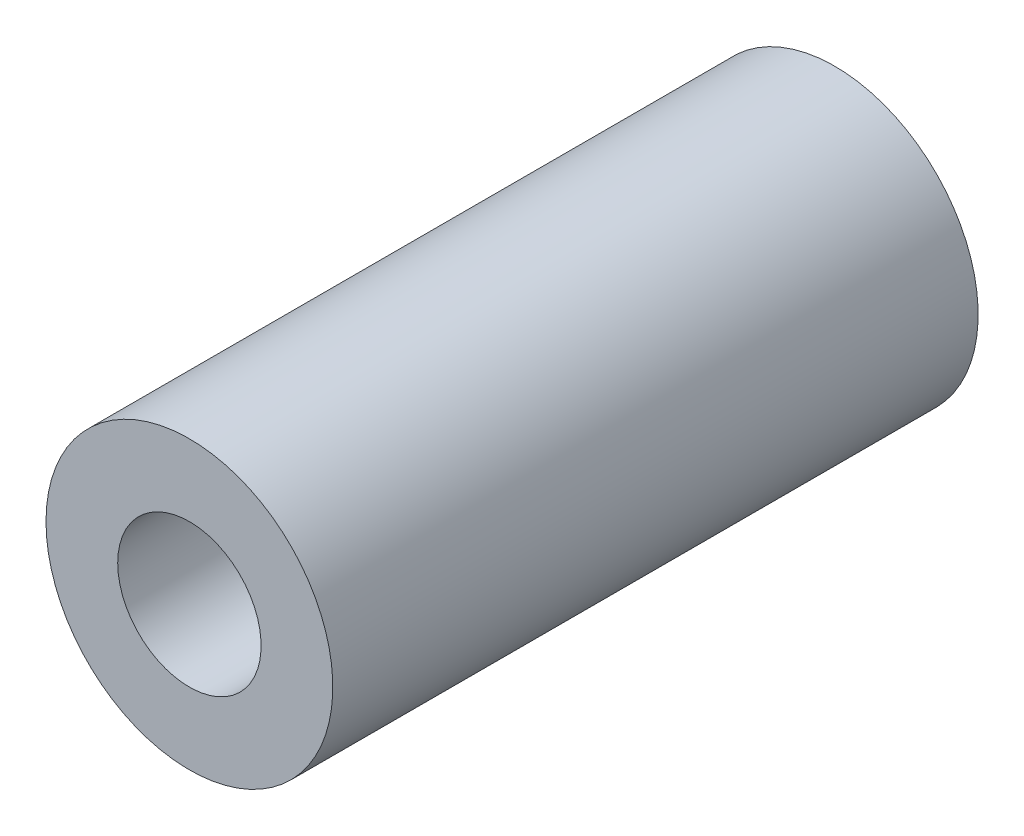
ISO-10303-21;
HEADER;
FILE_DESCRIPTION(('STEP AP214'),'2;1');
FILE_NAME('part.step','',(''),(''),'','','');
FILE_SCHEMA(('AUTOMOTIVE_DESIGN { 1 0 10303 214 1 1 1 1 }'));
ENDSEC;
DATA;
#1=APPLICATION_CONTEXT('core data for automotive mechanical design processes');
#2=APPLICATION_PROTOCOL_DEFINITION('international standard','automotive_design',2000,#1);
#3=PRODUCT_CONTEXT('',#1,'mechanical');
#4=PRODUCT('Part','Part','',(#3));
#5=PRODUCT_RELATED_PRODUCT_CATEGORY('part','',(#4));
#6=PRODUCT_DEFINITION_FORMATION('','',#4);
#7=PRODUCT_DEFINITION_CONTEXT('part definition',#1,'design');
#8=PRODUCT_DEFINITION('design','',#6,#7);
#9=PRODUCT_DEFINITION_SHAPE('','',#8);
#10=(LENGTH_UNIT() NAMED_UNIT(*) SI_UNIT(.MILLI.,.METRE.));
#11=(NAMED_UNIT(*) PLANE_ANGLE_UNIT() SI_UNIT($,.RADIAN.));
#12=(NAMED_UNIT(*) SI_UNIT($,.STERADIAN.) SOLID_ANGLE_UNIT());
#13=UNCERTAINTY_MEASURE_WITH_UNIT(LENGTH_MEASURE(1.E-05),#10,'distance_accuracy_value','');
#14=(GEOMETRIC_REPRESENTATION_CONTEXT(3) GLOBAL_UNCERTAINTY_ASSIGNED_CONTEXT((#13)) GLOBAL_UNIT_ASSIGNED_CONTEXT((#10,
#11,#12)) REPRESENTATION_CONTEXT('',''));
#15=CARTESIAN_POINT('',(0.,0.,0.));
#16=DIRECTION('',(0.,0.,1.));
#17=DIRECTION('',(1.,0.,0.));
#18=AXIS2_PLACEMENT_3D('',#15,#16,#17);
#19=CARTESIAN_POINT('',(0.,0.,45.));
#20=DIRECTION('',(0.,0.,1.));
#21=DIRECTION('',(1.,0.,0.));
#22=AXIS2_PLACEMENT_3D('',#19,#20,#21);
#23=PLANE('',#22);
#24=CARTESIAN_POINT('',(0.,0.,45.));
#25=DIRECTION('',(0.,0.,1.));
#26=DIRECTION('',(1.,0.,0.));
#27=AXIS2_PLACEMENT_3D('',#24,#25,#26);
#28=CIRCLE('',#27,10.);
#29=CARTESIAN_POINT('',(-10.,0.,45.));
#30=VERTEX_POINT('',#29);
#31=EDGE_CURVE('E10',#30,#30,#28,.T.);
#32=ORIENTED_EDGE('',*,*,#31,.T.);
#33=EDGE_LOOP('',(#32));
#34=FACE_BOUND('',#33,.T.);
#35=CARTESIAN_POINT('',(0.,0.,45.));
#36=DIRECTION('',(0.,0.,1.));
#37=DIRECTION('',(1.,0.,0.));
#38=AXIS2_PLACEMENT_3D('',#35,#36,#37);
#39=CIRCLE('',#38,5.);
#40=CARTESIAN_POINT('',(-5.,0.,45.));
#41=VERTEX_POINT('',#40);
#42=EDGE_CURVE('E50',#41,#41,#39,.T.);
#43=ORIENTED_EDGE('',*,*,#42,.F.);
#44=EDGE_LOOP('',(#43));
#45=FACE_BOUND('',#44,.T.);
#46=ADVANCED_FACE('F37',(#34,#45),#23,.T.);
#47=CARTESIAN_POINT('',(0.,0.,0.));
#48=DIRECTION('',(0.,0.,1.));
#49=DIRECTION('',(1.,0.,0.));
#50=AXIS2_PLACEMENT_3D('',#47,#48,#49);
#51=PLANE('',#50);
#52=CARTESIAN_POINT('',(0.,0.,0.));
#53=DIRECTION('',(0.,0.,1.));
#54=DIRECTION('',(1.,0.,0.));
#55=AXIS2_PLACEMENT_3D('',#52,#53,#54);
#56=CIRCLE('',#55,10.);
#57=CARTESIAN_POINT('',(-10.,0.,0.));
#58=VERTEX_POINT('',#57);
#59=EDGE_CURVE('E41',#58,#58,#56,.T.);
#60=ORIENTED_EDGE('',*,*,#59,.F.);
#61=EDGE_LOOP('',(#60));
#62=FACE_BOUND('',#61,.T.);
#63=CARTESIAN_POINT('',(0.,0.,0.));
#64=DIRECTION('',(0.,0.,1.));
#65=DIRECTION('',(1.,0.,0.));
#66=AXIS2_PLACEMENT_3D('',#63,#64,#65);
#67=CIRCLE('',#66,5.);
#68=CARTESIAN_POINT('',(-5.,0.,0.));
#69=VERTEX_POINT('',#68);
#70=EDGE_CURVE('E52',#69,#69,#67,.T.);
#71=ORIENTED_EDGE('',*,*,#70,.T.);
#72=EDGE_LOOP('',(#71));
#73=FACE_BOUND('',#72,.T.);
#74=ADVANCED_FACE('F64',(#62,#73),#51,.F.);
#75=CARTESIAN_POINT('',(0.,0.,45.));
#76=DIRECTION('',(0.,0.,-1.));
#77=DIRECTION('',(-1.,0.,0.));
#78=AXIS2_PLACEMENT_3D('',#75,#76,#77);
#79=CYLINDRICAL_SURFACE('',#78,10.);
#80=CARTESIAN_POINT('',(-10.,0.,45.));
#81=CARTESIAN_POINT('',(-10.,0.,44.53125));
#82=CARTESIAN_POINT('',(-10.,0.,44.0625));
#83=CARTESIAN_POINT('',(-10.,0.,43.125));
#84=CARTESIAN_POINT('',(-10.,0.,42.65625));
#85=CARTESIAN_POINT('',(-10.,0.,41.71875));
#86=CARTESIAN_POINT('',(-10.,0.,41.25));
#87=CARTESIAN_POINT('',(-10.,0.,40.3125));
#88=CARTESIAN_POINT('',(-10.,0.,39.84375));
#89=CARTESIAN_POINT('',(-10.,0.,38.90625));
#90=CARTESIAN_POINT('',(-10.,0.,38.4375));
#91=CARTESIAN_POINT('',(-10.,0.,37.5));
#92=CARTESIAN_POINT('',(-10.,0.,37.03125));
#93=CARTESIAN_POINT('',(-10.,0.,36.09375));
#94=CARTESIAN_POINT('',(-10.,0.,35.625));
#95=CARTESIAN_POINT('',(-10.,0.,34.6875));
#96=CARTESIAN_POINT('',(-10.,0.,34.21875));
#97=CARTESIAN_POINT('',(-10.,0.,33.28125));
#98=CARTESIAN_POINT('',(-10.,0.,32.8125));
#99=CARTESIAN_POINT('',(-10.,0.,31.875));
#100=CARTESIAN_POINT('',(-10.,0.,31.40625));
#101=CARTESIAN_POINT('',(-10.,0.,30.46875));
#102=CARTESIAN_POINT('',(-10.,0.,30.));
#103=CARTESIAN_POINT('',(-10.,0.,29.0625));
#104=CARTESIAN_POINT('',(-10.,0.,28.59375));
#105=CARTESIAN_POINT('',(-10.,0.,27.65625));
#106=CARTESIAN_POINT('',(-10.,0.,27.1875));
#107=CARTESIAN_POINT('',(-10.,0.,26.25));
#108=CARTESIAN_POINT('',(-10.,0.,25.78125));
#109=CARTESIAN_POINT('',(-10.,0.,24.84375));
#110=CARTESIAN_POINT('',(-10.,0.,24.375));
#111=CARTESIAN_POINT('',(-10.,0.,23.4375));
#112=CARTESIAN_POINT('',(-10.,0.,22.96875));
#113=CARTESIAN_POINT('',(-10.,0.,22.03125));
#114=CARTESIAN_POINT('',(-10.,0.,21.5625));
#115=CARTESIAN_POINT('',(-10.,0.,20.625));
#116=CARTESIAN_POINT('',(-10.,0.,20.15625));
#117=CARTESIAN_POINT('',(-10.,0.,19.21875));
#118=CARTESIAN_POINT('',(-10.,0.,18.75));
#119=CARTESIAN_POINT('',(-10.,0.,17.8125));
#120=CARTESIAN_POINT('',(-10.,0.,17.34375));
#121=CARTESIAN_POINT('',(-10.,0.,16.40625));
#122=CARTESIAN_POINT('',(-10.,0.,15.9375));
#123=CARTESIAN_POINT('',(-10.,0.,15.));
#124=CARTESIAN_POINT('',(-10.,0.,14.53125));
#125=CARTESIAN_POINT('',(-10.,0.,13.59375));
#126=CARTESIAN_POINT('',(-10.,0.,13.125));
#127=CARTESIAN_POINT('',(-10.,0.,12.1875));
#128=CARTESIAN_POINT('',(-10.,0.,11.71875));
#129=CARTESIAN_POINT('',(-10.,0.,10.78125));
#130=CARTESIAN_POINT('',(-10.,0.,10.3125));
#131=CARTESIAN_POINT('',(-10.,0.,9.375));
#132=CARTESIAN_POINT('',(-10.,0.,8.90625));
#133=CARTESIAN_POINT('',(-10.,0.,7.96874999999999));
#134=CARTESIAN_POINT('',(-10.,0.,7.5));
#135=CARTESIAN_POINT('',(-10.,0.,6.5625));
#136=CARTESIAN_POINT('',(-10.,0.,6.09375));
#137=CARTESIAN_POINT('',(-10.,0.,5.15625));
#138=CARTESIAN_POINT('',(-10.,0.,4.68749999999999));
#139=CARTESIAN_POINT('',(-10.,0.,3.74999999999999));
#140=CARTESIAN_POINT('',(-10.,0.,3.28124999999999));
#141=CARTESIAN_POINT('',(-10.,0.,2.34374999999999));
#142=CARTESIAN_POINT('',(-10.,0.,1.87499999999999));
#143=CARTESIAN_POINT('',(-10.,0.,0.937499999999992));
#144=CARTESIAN_POINT('',(-10.,0.,0.468749999999993));
#145=CARTESIAN_POINT('',(-10.,0.,0.));
#146=B_SPLINE_CURVE_WITH_KNOTS('',3,(#80,#81,#82,#83,#84,#85,#86,#87,#88,#89,#90,#91,#92,#93,
#94,#95,#96,#97,#98,#99,#100,#101,#102,#103,#104,#105,#106,#107,#108,#109,#110,#111,#112,#113,
#114,#115,#116,#117,#118,#119,#120,#121,#122,#123,#124,#125,#126,#127,#128,#129,#130,#131,#132,
#133,#134,#135,#136,#137,#138,#139,#140,#141,#142,#143,#144,#145),.UNSPECIFIED.,.F.,.F.,(4,2,2,
2,2,2,2,2,2,2,2,2,2,2,2,2,2,2,2,2,2,2,2,2,2,2,2,2,2,2,2,2,4),(0.,1.40625,2.8125,
4.21875000000001,5.62500000000001,7.03125,8.4375,9.84375000000001,11.25,12.65625,14.0625,
15.46875,16.875,18.28125,19.6875,21.09375,22.5,23.90625,25.3125,26.71875,28.125,29.53125,
30.9375,32.34375,33.75,35.15625,36.5625,37.96875,39.375,40.78125,42.1875,43.59375,45.),.UNSPECIFIED.);
#147=EDGE_CURVE('BSEAM39',#30,#58,#146,.T.);
#148=ORIENTED_EDGE('',*,*,#31,.F.);
#149=ORIENTED_EDGE('',*,*,#59,.T.);
#150=ORIENTED_EDGE('',*,*,#147,.T.);
#151=ORIENTED_EDGE('',*,*,#147,.F.);
#152=EDGE_LOOP('',(#148,#150,#149,#151));
#153=FACE_BOUND('',#152,.T.);
#154=ADVANCED_FACE('F39',(#153),#79,.T.);
#155=CARTESIAN_POINT('',(0.,0.,45.));
#156=DIRECTION('',(0.,0.,-1.));
#157=DIRECTION('',(-1.,0.,0.));
#158=AXIS2_PLACEMENT_3D('',#155,#156,#157);
#159=CYLINDRICAL_SURFACE('',#158,5.);
#160=CARTESIAN_POINT('',(-5.,0.,45.));
#161=CARTESIAN_POINT('',(-5.,0.,44.53125));
#162=CARTESIAN_POINT('',(-5.,0.,44.0625));
#163=CARTESIAN_POINT('',(-5.,0.,43.125));
#164=CARTESIAN_POINT('',(-5.,0.,42.65625));
#165=CARTESIAN_POINT('',(-5.,0.,41.71875));
#166=CARTESIAN_POINT('',(-5.,0.,41.25));
#167=CARTESIAN_POINT('',(-5.,0.,40.3125));
#168=CARTESIAN_POINT('',(-5.,0.,39.84375));
#169=CARTESIAN_POINT('',(-5.,0.,38.90625));
#170=CARTESIAN_POINT('',(-5.,0.,38.4375));
#171=CARTESIAN_POINT('',(-5.,0.,37.5));
#172=CARTESIAN_POINT('',(-5.,0.,37.03125));
#173=CARTESIAN_POINT('',(-5.,0.,36.09375));
#174=CARTESIAN_POINT('',(-5.,0.,35.625));
#175=CARTESIAN_POINT('',(-5.,0.,34.6875));
#176=CARTESIAN_POINT('',(-5.,0.,34.21875));
#177=CARTESIAN_POINT('',(-5.,0.,33.28125));
#178=CARTESIAN_POINT('',(-5.,0.,32.8125));
#179=CARTESIAN_POINT('',(-5.,0.,31.875));
#180=CARTESIAN_POINT('',(-5.,0.,31.40625));
#181=CARTESIAN_POINT('',(-5.,0.,30.46875));
#182=CARTESIAN_POINT('',(-5.,0.,30.));
#183=CARTESIAN_POINT('',(-5.,0.,29.0625));
#184=CARTESIAN_POINT('',(-5.,0.,28.59375));
#185=CARTESIAN_POINT('',(-5.,0.,27.65625));
#186=CARTESIAN_POINT('',(-5.,0.,27.1875));
#187=CARTESIAN_POINT('',(-5.,0.,26.25));
#188=CARTESIAN_POINT('',(-5.,0.,25.78125));
#189=CARTESIAN_POINT('',(-5.,0.,24.84375));
#190=CARTESIAN_POINT('',(-5.,0.,24.375));
#191=CARTESIAN_POINT('',(-5.,0.,23.4375));
#192=CARTESIAN_POINT('',(-5.,0.,22.96875));
#193=CARTESIAN_POINT('',(-5.,0.,22.03125));
#194=CARTESIAN_POINT('',(-5.,0.,21.5625));
#195=CARTESIAN_POINT('',(-5.,0.,20.625));
#196=CARTESIAN_POINT('',(-5.,0.,20.15625));
#197=CARTESIAN_POINT('',(-5.,0.,19.21875));
#198=CARTESIAN_POINT('',(-5.,0.,18.75));
#199=CARTESIAN_POINT('',(-5.,0.,17.8125));
#200=CARTESIAN_POINT('',(-5.,0.,17.34375));
#201=CARTESIAN_POINT('',(-5.,0.,16.40625));
#202=CARTESIAN_POINT('',(-5.,0.,15.9375));
#203=CARTESIAN_POINT('',(-5.,0.,15.));
#204=CARTESIAN_POINT('',(-5.,0.,14.53125));
#205=CARTESIAN_POINT('',(-5.,0.,13.59375));
#206=CARTESIAN_POINT('',(-5.,0.,13.125));
#207=CARTESIAN_POINT('',(-5.,0.,12.1875));
#208=CARTESIAN_POINT('',(-5.,0.,11.71875));
#209=CARTESIAN_POINT('',(-5.,0.,10.78125));
#210=CARTESIAN_POINT('',(-5.,0.,10.3125));
#211=CARTESIAN_POINT('',(-5.,0.,9.375));
#212=CARTESIAN_POINT('',(-5.,0.,8.90625));
#213=CARTESIAN_POINT('',(-5.,0.,7.96874999999999));
#214=CARTESIAN_POINT('',(-5.,0.,7.5));
#215=CARTESIAN_POINT('',(-5.,0.,6.5625));
#216=CARTESIAN_POINT('',(-5.,0.,6.09375));
#217=CARTESIAN_POINT('',(-5.,0.,5.15625));
#218=CARTESIAN_POINT('',(-5.,0.,4.68749999999999));
#219=CARTESIAN_POINT('',(-5.,0.,3.74999999999999));
#220=CARTESIAN_POINT('',(-5.,0.,3.28124999999999));
#221=CARTESIAN_POINT('',(-5.,0.,2.34374999999999));
#222=CARTESIAN_POINT('',(-5.,0.,1.87499999999999));
#223=CARTESIAN_POINT('',(-5.,0.,0.937499999999992));
#224=CARTESIAN_POINT('',(-5.,0.,0.468749999999993));
#225=CARTESIAN_POINT('',(-5.,0.,0.));
#226=B_SPLINE_CURVE_WITH_KNOTS('',3,(#160,#161,#162,#163,#164,#165,#166,#167,#168,#169,#170,
#171,#172,#173,#174,#175,#176,#177,#178,#179,#180,#181,#182,#183,#184,#185,#186,#187,#188,#189,
#190,#191,#192,#193,#194,#195,#196,#197,#198,#199,#200,#201,#202,#203,#204,#205,#206,#207,#208,
#209,#210,#211,#212,#213,#214,#215,#216,#217,#218,#219,#220,#221,#222,#223,#224,#225),
.UNSPECIFIED.,.F.,.F.,(4,2,2,2,2,2,2,2,2,2,2,2,2,2,2,2,2,2,2,2,2,2,2,2,2,2,2,2,2,2,2,2,4),(0.,
1.40625,2.8125,4.21875000000001,5.62500000000001,7.03125,8.4375,9.84375000000001,11.25,12.65625,
14.0625,15.46875,16.875,18.28125,19.6875,21.09375,22.5,23.90625,25.3125,26.71875,28.125,
29.53125,30.9375,32.34375,33.75,35.15625,36.5625,37.96875,39.375,40.78125,42.1875,43.59375,45.),.UNSPECIFIED.);
#227=EDGE_CURVE('BSEAM60',#41,#69,#226,.T.);
#228=ORIENTED_EDGE('',*,*,#42,.T.);
#229=ORIENTED_EDGE('',*,*,#70,.F.);
#230=ORIENTED_EDGE('',*,*,#227,.T.);
#231=ORIENTED_EDGE('',*,*,#227,.F.);
#232=EDGE_LOOP('',(#228,#230,#229,#231));
#233=FACE_BOUND('',#232,.T.);
#234=ADVANCED_FACE('F60',(#233),#159,.F.);
#235=CLOSED_SHELL('',(#46,#74,#154,#234));
#236=MANIFOLD_SOLID_BREP('B2',#235);
#237=ADVANCED_BREP_SHAPE_REPRESENTATION('',(#18,#236),#14);
#238=SHAPE_DEFINITION_REPRESENTATION(#9,#237);
ENDSEC;
END-ISO-10303-21;
